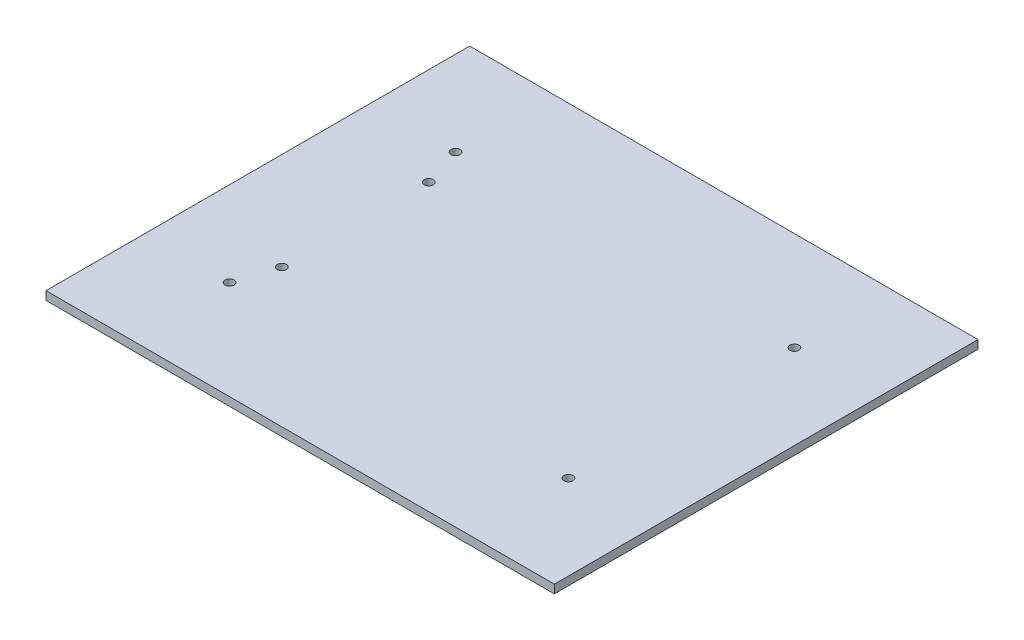
ISO-10303-21;
HEADER;
FILE_DESCRIPTION(('STEP AP214'),'2;1');
FILE_NAME('part.step','',(''),(''),'','','');
FILE_SCHEMA(('AUTOMOTIVE_DESIGN { 1 0 10303 214 1 1 1 1 }'));
ENDSEC;
DATA;
#1=APPLICATION_CONTEXT('core data for automotive mechanical design processes');
#2=APPLICATION_PROTOCOL_DEFINITION('international standard','automotive_design',2000,#1);
#3=PRODUCT_CONTEXT('',#1,'mechanical');
#4=PRODUCT('Part','Part','',(#3));
#5=PRODUCT_RELATED_PRODUCT_CATEGORY('part','',(#4));
#6=PRODUCT_DEFINITION_FORMATION('','',#4);
#7=PRODUCT_DEFINITION_CONTEXT('part definition',#1,'design');
#8=PRODUCT_DEFINITION('design','',#6,#7);
#9=PRODUCT_DEFINITION_SHAPE('','',#8);
#10=(LENGTH_UNIT() NAMED_UNIT(*) SI_UNIT(.MILLI.,.METRE.));
#11=(NAMED_UNIT(*) PLANE_ANGLE_UNIT() SI_UNIT($,.RADIAN.));
#12=(NAMED_UNIT(*) SI_UNIT($,.STERADIAN.) SOLID_ANGLE_UNIT());
#13=UNCERTAINTY_MEASURE_WITH_UNIT(LENGTH_MEASURE(1.E-05),#10,'distance_accuracy_value','');
#14=(GEOMETRIC_REPRESENTATION_CONTEXT(3) GLOBAL_UNCERTAINTY_ASSIGNED_CONTEXT((#13)) GLOBAL_UNIT_ASSIGNED_CONTEXT((#10,
#11,#12)) REPRESENTATION_CONTEXT('',''));
#15=CARTESIAN_POINT('',(0.,0.,0.));
#16=DIRECTION('',(0.,0.,1.));
#17=DIRECTION('',(1.,0.,0.));
#18=AXIS2_PLACEMENT_3D('',#15,#16,#17);
#19=CARTESIAN_POINT('',(0.,3.,0.));
#20=DIRECTION('',(0.,-1.,0.));
#21=DIRECTION('',(0.,0.,-1.));
#22=AXIS2_PLACEMENT_3D('',#19,#20,#21);
#23=PLANE('',#22);
#24=DIRECTION('',(0.,0.,-1.));
#25=VECTOR('',#24,1.);
#26=CARTESIAN_POINT('',(90.,3.,75.));
#27=LINE('',#26,#25);
#28=CARTESIAN_POINT('',(90.,3.,75.));
#29=VERTEX_POINT('',#28);
#30=CARTESIAN_POINT('',(90.,3.,-75.));
#31=VERTEX_POINT('',#30);
#32=EDGE_CURVE('E85',#29,#31,#27,.T.);
#33=ORIENTED_EDGE('',*,*,#32,.T.);
#34=DIRECTION('',(-1.,0.,0.));
#35=VECTOR('',#34,1.);
#36=CARTESIAN_POINT('',(-90.,3.,-75.));
#37=LINE('',#36,#35);
#38=CARTESIAN_POINT('',(-90.,3.,-75.));
#39=VERTEX_POINT('',#38);
#40=EDGE_CURVE('E80',#31,#39,#37,.T.);
#41=ORIENTED_EDGE('',*,*,#40,.T.);
#42=DIRECTION('',(0.,0.,1.));
#43=VECTOR('',#42,1.);
#44=CARTESIAN_POINT('',(-90.,3.,75.));
#45=LINE('',#44,#43);
#46=CARTESIAN_POINT('',(-90.,3.,75.));
#47=VERTEX_POINT('',#46);
#48=EDGE_CURVE('E83',#39,#47,#45,.T.);
#49=ORIENTED_EDGE('',*,*,#48,.T.);
#50=DIRECTION('',(1.,0.,0.));
#51=VECTOR('',#50,1.);
#52=CARTESIAN_POINT('',(-90.,3.,75.));
#53=LINE('',#52,#51);
#54=EDGE_CURVE('E50',#47,#29,#53,.T.);
#55=ORIENTED_EDGE('',*,*,#54,.T.);
#56=EDGE_LOOP('',(#33,#41,#49,#55));
#57=FACE_BOUND('',#56,.T.);
#58=CARTESIAN_POINT('',(-55.5,3.,26.));
#59=DIRECTION('',(0.,1.,0.));
#60=DIRECTION('',(0.,0.,1.));
#61=AXIS2_PLACEMENT_3D('',#58,#59,#60);
#62=CIRCLE('',#61,1.6);
#63=CARTESIAN_POINT('',(-55.5,3.,27.6));
#64=VERTEX_POINT('',#63);
#65=EDGE_CURVE('E100',#64,#64,#62,.T.);
#66=ORIENTED_EDGE('',*,*,#65,.F.);
#67=EDGE_LOOP('',(#66));
#68=FACE_BOUND('',#67,.T.);
#69=CARTESIAN_POINT('',(-60.,3.,40.));
#70=DIRECTION('',(0.,1.,0.));
#71=DIRECTION('',(0.,0.,1.));
#72=AXIS2_PLACEMENT_3D('',#69,#70,#71);
#73=CIRCLE('',#72,1.6);
#74=CARTESIAN_POINT('',(-60.,3.,41.6));
#75=VERTEX_POINT('',#74);
#76=EDGE_CURVE('E115',#75,#75,#73,.T.);
#77=ORIENTED_EDGE('',*,*,#76,.F.);
#78=EDGE_LOOP('',(#77));
#79=FACE_BOUND('',#78,.T.);
#80=CARTESIAN_POINT('',(-60.0000000000002,3.,-40.));
#81=DIRECTION('',(0.,1.,0.));
#82=DIRECTION('',(0.,0.,1.));
#83=AXIS2_PLACEMENT_3D('',#80,#81,#82);
#84=CIRCLE('',#83,1.6);
#85=CARTESIAN_POINT('',(-60.0000000000002,3.,-38.4));
#86=VERTEX_POINT('',#85);
#87=EDGE_CURVE('E121',#86,#86,#84,.T.);
#88=ORIENTED_EDGE('',*,*,#87,.F.);
#89=EDGE_LOOP('',(#88));
#90=FACE_BOUND('',#89,.T.);
#91=CARTESIAN_POINT('',(60.,3.,40.));
#92=DIRECTION('',(0.,1.,0.));
#93=DIRECTION('',(0.,0.,1.));
#94=AXIS2_PLACEMENT_3D('',#91,#92,#93);
#95=CIRCLE('',#94,1.6);
#96=CARTESIAN_POINT('',(60.,3.,41.6));
#97=VERTEX_POINT('',#96);
#98=EDGE_CURVE('E127',#97,#97,#95,.T.);
#99=ORIENTED_EDGE('',*,*,#98,.F.);
#100=EDGE_LOOP('',(#99));
#101=FACE_BOUND('',#100,.T.);
#102=CARTESIAN_POINT('',(59.9999999999998,3.,-40.));
#103=DIRECTION('',(0.,1.,0.));
#104=DIRECTION('',(0.,0.,1.));
#105=AXIS2_PLACEMENT_3D('',#102,#103,#104);
#106=CIRCLE('',#105,1.6);
#107=CARTESIAN_POINT('',(59.9999999999998,3.,-38.4));
#108=VERTEX_POINT('',#107);
#109=EDGE_CURVE('E133',#108,#108,#106,.T.);
#110=ORIENTED_EDGE('',*,*,#109,.F.);
#111=EDGE_LOOP('',(#110));
#112=FACE_BOUND('',#111,.T.);
#113=CARTESIAN_POINT('',(-55.5000000000002,3.,-26.));
#114=DIRECTION('',(0.,1.,0.));
#115=DIRECTION('',(0.,0.,1.));
#116=AXIS2_PLACEMENT_3D('',#113,#114,#115);
#117=CIRCLE('',#116,1.6);
#118=CARTESIAN_POINT('',(-55.5000000000002,3.,-24.4));
#119=VERTEX_POINT('',#118);
#120=EDGE_CURVE('E139',#119,#119,#117,.T.);
#121=ORIENTED_EDGE('',*,*,#120,.F.);
#122=EDGE_LOOP('',(#121));
#123=FACE_BOUND('',#122,.T.);
#124=ADVANCED_FACE('F33',(#57,#68,#79,#90,#101,#112,#123),#23,.F.);
#125=CARTESIAN_POINT('',(0.,0.,0.));
#126=DIRECTION('',(0.,-1.,0.));
#127=DIRECTION('',(0.,0.,-1.));
#128=AXIS2_PLACEMENT_3D('',#125,#126,#127);
#129=PLANE('',#128);
#130=CARTESIAN_POINT('',(59.9999999999998,0.,-40.));
#131=DIRECTION('',(0.,1.,0.));
#132=DIRECTION('',(0.,0.,1.));
#133=AXIS2_PLACEMENT_3D('',#130,#131,#132);
#134=CIRCLE('',#133,1.6);
#135=CARTESIAN_POINT('',(59.9999999999998,0.,-38.4));
#136=VERTEX_POINT('',#135);
#137=EDGE_CURVE('E136',#136,#136,#134,.T.);
#138=ORIENTED_EDGE('',*,*,#137,.T.);
#139=EDGE_LOOP('',(#138));
#140=FACE_BOUND('',#139,.T.);
#141=CARTESIAN_POINT('',(-60.0000000000002,0.,-40.));
#142=DIRECTION('',(0.,1.,0.));
#143=DIRECTION('',(0.,0.,1.));
#144=AXIS2_PLACEMENT_3D('',#141,#142,#143);
#145=CIRCLE('',#144,1.6);
#146=CARTESIAN_POINT('',(-60.0000000000002,0.,-38.4));
#147=VERTEX_POINT('',#146);
#148=EDGE_CURVE('E124',#147,#147,#145,.T.);
#149=ORIENTED_EDGE('',*,*,#148,.T.);
#150=EDGE_LOOP('',(#149));
#151=FACE_BOUND('',#150,.T.);
#152=CARTESIAN_POINT('',(-55.5,0.,26.));
#153=DIRECTION('',(0.,1.,0.));
#154=DIRECTION('',(0.,0.,1.));
#155=AXIS2_PLACEMENT_3D('',#152,#153,#154);
#156=CIRCLE('',#155,1.6);
#157=CARTESIAN_POINT('',(-55.5,0.,27.6));
#158=VERTEX_POINT('',#157);
#159=EDGE_CURVE('E112',#158,#158,#156,.T.);
#160=ORIENTED_EDGE('',*,*,#159,.T.);
#161=EDGE_LOOP('',(#160));
#162=FACE_BOUND('',#161,.T.);
#163=DIRECTION('',(0.,0.,-1.));
#164=VECTOR('',#163,1.);
#165=CARTESIAN_POINT('',(90.,0.,75.));
#166=LINE('',#165,#164);
#167=CARTESIAN_POINT('',(90.,0.,75.));
#168=VERTEX_POINT('',#167);
#169=CARTESIAN_POINT('',(90.,0.,-75.));
#170=VERTEX_POINT('',#169);
#171=EDGE_CURVE('E97',#168,#170,#166,.T.);
#172=ORIENTED_EDGE('',*,*,#171,.F.);
#173=DIRECTION('',(1.,0.,0.));
#174=VECTOR('',#173,1.);
#175=CARTESIAN_POINT('',(-90.,0.,75.));
#176=LINE('',#175,#174);
#177=CARTESIAN_POINT('',(-90.,0.,75.));
#178=VERTEX_POINT('',#177);
#179=EDGE_CURVE('E73',#178,#168,#176,.T.);
#180=ORIENTED_EDGE('',*,*,#179,.F.);
#181=DIRECTION('',(0.,0.,1.));
#182=VECTOR('',#181,1.);
#183=CARTESIAN_POINT('',(-90.,0.,75.));
#184=LINE('',#183,#182);
#185=CARTESIAN_POINT('',(-90.,0.,-75.));
#186=VERTEX_POINT('',#185);
#187=EDGE_CURVE('E67',#186,#178,#184,.T.);
#188=ORIENTED_EDGE('',*,*,#187,.F.);
#189=DIRECTION('',(-1.,0.,0.));
#190=VECTOR('',#189,1.);
#191=CARTESIAN_POINT('',(-90.,0.,-75.));
#192=LINE('',#191,#190);
#193=EDGE_CURVE('E89',#170,#186,#192,.T.);
#194=ORIENTED_EDGE('',*,*,#193,.F.);
#195=EDGE_LOOP('',(#172,#180,#188,#194));
#196=FACE_BOUND('',#195,.T.);
#197=CARTESIAN_POINT('',(-60.,0.,40.));
#198=DIRECTION('',(0.,1.,0.));
#199=DIRECTION('',(0.,0.,1.));
#200=AXIS2_PLACEMENT_3D('',#197,#198,#199);
#201=CIRCLE('',#200,1.6);
#202=CARTESIAN_POINT('',(-60.,0.,41.6));
#203=VERTEX_POINT('',#202);
#204=EDGE_CURVE('E118',#203,#203,#201,.T.);
#205=ORIENTED_EDGE('',*,*,#204,.T.);
#206=EDGE_LOOP('',(#205));
#207=FACE_BOUND('',#206,.T.);
#208=CARTESIAN_POINT('',(60.,0.,40.));
#209=DIRECTION('',(0.,1.,0.));
#210=DIRECTION('',(0.,0.,1.));
#211=AXIS2_PLACEMENT_3D('',#208,#209,#210);
#212=CIRCLE('',#211,1.6);
#213=CARTESIAN_POINT('',(60.,0.,41.6));
#214=VERTEX_POINT('',#213);
#215=EDGE_CURVE('E130',#214,#214,#212,.T.);
#216=ORIENTED_EDGE('',*,*,#215,.T.);
#217=EDGE_LOOP('',(#216));
#218=FACE_BOUND('',#217,.T.);
#219=CARTESIAN_POINT('',(-55.5000000000002,0.,-26.));
#220=DIRECTION('',(0.,1.,0.));
#221=DIRECTION('',(0.,0.,1.));
#222=AXIS2_PLACEMENT_3D('',#219,#220,#221);
#223=CIRCLE('',#222,1.6);
#224=CARTESIAN_POINT('',(-55.5000000000002,0.,-24.4));
#225=VERTEX_POINT('',#224);
#226=EDGE_CURVE('E142',#225,#225,#223,.T.);
#227=ORIENTED_EDGE('',*,*,#226,.T.);
#228=EDGE_LOOP('',(#227));
#229=FACE_BOUND('',#228,.T.);
#230=ADVANCED_FACE('F108',(#140,#151,#162,#196,#207,#218,#229),#129,.T.);
#231=CARTESIAN_POINT('',(90.,3.,75.));
#232=DIRECTION('',(-1.,0.,0.));
#233=DIRECTION('',(0.,0.,1.));
#234=AXIS2_PLACEMENT_3D('',#231,#232,#233);
#235=PLANE('',#234);
#236=ORIENTED_EDGE('',*,*,#171,.T.);
#237=DIRECTION('',(0.,-1.,0.));
#238=VECTOR('',#237,1.);
#239=CARTESIAN_POINT('',(90.,3.,-75.));
#240=LINE('',#239,#238);
#241=EDGE_CURVE('E11',#31,#170,#240,.T.);
#242=ORIENTED_EDGE('',*,*,#241,.F.);
#243=ORIENTED_EDGE('',*,*,#32,.F.);
#244=DIRECTION('',(0.,-1.,0.));
#245=VECTOR('',#244,1.);
#246=CARTESIAN_POINT('',(90.,3.,75.));
#247=LINE('',#246,#245);
#248=EDGE_CURVE('E93',#29,#168,#247,.T.);
#249=ORIENTED_EDGE('',*,*,#248,.T.);
#250=EDGE_LOOP('',(#236,#242,#243,#249));
#251=FACE_BOUND('',#250,.T.);
#252=ADVANCED_FACE('F35',(#251),#235,.F.);
#253=CARTESIAN_POINT('',(-90.,3.,-75.));
#254=DIRECTION('',(0.,0.,1.));
#255=DIRECTION('',(1.,0.,0.));
#256=AXIS2_PLACEMENT_3D('',#253,#254,#255);
#257=PLANE('',#256);
#258=ORIENTED_EDGE('',*,*,#193,.T.);
#259=DIRECTION('',(0.,-1.,0.));
#260=VECTOR('',#259,1.);
#261=CARTESIAN_POINT('',(-90.,3.,-75.));
#262=LINE('',#261,#260);
#263=EDGE_CURVE('E42',#39,#186,#262,.T.);
#264=ORIENTED_EDGE('',*,*,#263,.F.);
#265=ORIENTED_EDGE('',*,*,#40,.F.);
#266=ORIENTED_EDGE('',*,*,#241,.T.);
#267=EDGE_LOOP('',(#258,#264,#265,#266));
#268=FACE_BOUND('',#267,.T.);
#269=ADVANCED_FACE('F88',(#268),#257,.F.);
#270=CARTESIAN_POINT('',(-90.,3.,75.));
#271=DIRECTION('',(1.,0.,0.));
#272=DIRECTION('',(0.,0.,-1.));
#273=AXIS2_PLACEMENT_3D('',#270,#271,#272);
#274=PLANE('',#273);
#275=ORIENTED_EDGE('',*,*,#187,.T.);
#276=DIRECTION('',(0.,-1.,0.));
#277=VECTOR('',#276,1.);
#278=CARTESIAN_POINT('',(-90.,3.,75.));
#279=LINE('',#278,#277);
#280=EDGE_CURVE('E90',#47,#178,#279,.T.);
#281=ORIENTED_EDGE('',*,*,#280,.F.);
#282=ORIENTED_EDGE('',*,*,#48,.F.);
#283=ORIENTED_EDGE('',*,*,#263,.T.);
#284=EDGE_LOOP('',(#275,#281,#282,#283));
#285=FACE_BOUND('',#284,.T.);
#286=ADVANCED_FACE('F91',(#285),#274,.F.);
#287=CARTESIAN_POINT('',(-90.,3.,75.));
#288=DIRECTION('',(0.,0.,-1.));
#289=DIRECTION('',(-1.,0.,0.));
#290=AXIS2_PLACEMENT_3D('',#287,#288,#289);
#291=PLANE('',#290);
#292=ORIENTED_EDGE('',*,*,#179,.T.);
#293=ORIENTED_EDGE('',*,*,#248,.F.);
#294=ORIENTED_EDGE('',*,*,#54,.F.);
#295=ORIENTED_EDGE('',*,*,#280,.T.);
#296=EDGE_LOOP('',(#292,#293,#294,#295));
#297=FACE_BOUND('',#296,.T.);
#298=ADVANCED_FACE('F105',(#297),#291,.F.);
#299=CARTESIAN_POINT('',(-55.5,3.,26.));
#300=DIRECTION('',(0.,-1.,0.));
#301=DIRECTION('',(0.,0.,-1.));
#302=AXIS2_PLACEMENT_3D('',#299,#300,#301);
#303=CYLINDRICAL_SURFACE('',#302,1.6);
#304=ORIENTED_EDGE('',*,*,#65,.T.);
#305=EDGE_LOOP('',(#304));
#306=FACE_BOUND('',#305,.T.);
#307=ORIENTED_EDGE('',*,*,#159,.F.);
#308=EDGE_LOOP('',(#307));
#309=FACE_BOUND('',#308,.T.);
#310=ADVANCED_FACE('F159',(#306,#309),#303,.F.);
#311=CARTESIAN_POINT('',(-60.,3.,40.));
#312=DIRECTION('',(0.,-1.,0.));
#313=DIRECTION('',(0.,0.,-1.));
#314=AXIS2_PLACEMENT_3D('',#311,#312,#313);
#315=CYLINDRICAL_SURFACE('',#314,1.6);
#316=ORIENTED_EDGE('',*,*,#76,.T.);
#317=EDGE_LOOP('',(#316));
#318=FACE_BOUND('',#317,.T.);
#319=ORIENTED_EDGE('',*,*,#204,.F.);
#320=EDGE_LOOP('',(#319));
#321=FACE_BOUND('',#320,.T.);
#322=ADVANCED_FACE('F205',(#318,#321),#315,.F.);
#323=CARTESIAN_POINT('',(-60.0000000000002,3.,-40.));
#324=DIRECTION('',(0.,-1.,0.));
#325=DIRECTION('',(0.,0.,-1.));
#326=AXIS2_PLACEMENT_3D('',#323,#324,#325);
#327=CYLINDRICAL_SURFACE('',#326,1.6);
#328=ORIENTED_EDGE('',*,*,#87,.T.);
#329=EDGE_LOOP('',(#328));
#330=FACE_BOUND('',#329,.T.);
#331=ORIENTED_EDGE('',*,*,#148,.F.);
#332=EDGE_LOOP('',(#331));
#333=FACE_BOUND('',#332,.T.);
#334=ADVANCED_FACE('F213',(#330,#333),#327,.F.);
#335=CARTESIAN_POINT('',(60.,3.,40.));
#336=DIRECTION('',(0.,-1.,0.));
#337=DIRECTION('',(0.,0.,-1.));
#338=AXIS2_PLACEMENT_3D('',#335,#336,#337);
#339=CYLINDRICAL_SURFACE('',#338,1.6);
#340=ORIENTED_EDGE('',*,*,#98,.T.);
#341=EDGE_LOOP('',(#340));
#342=FACE_BOUND('',#341,.T.);
#343=ORIENTED_EDGE('',*,*,#215,.F.);
#344=EDGE_LOOP('',(#343));
#345=FACE_BOUND('',#344,.T.);
#346=ADVANCED_FACE('F221',(#342,#345),#339,.F.);
#347=CARTESIAN_POINT('',(59.9999999999998,3.,-40.));
#348=DIRECTION('',(0.,-1.,0.));
#349=DIRECTION('',(0.,0.,-1.));
#350=AXIS2_PLACEMENT_3D('',#347,#348,#349);
#351=CYLINDRICAL_SURFACE('',#350,1.6);
#352=ORIENTED_EDGE('',*,*,#109,.T.);
#353=EDGE_LOOP('',(#352));
#354=FACE_BOUND('',#353,.T.);
#355=ORIENTED_EDGE('',*,*,#137,.F.);
#356=EDGE_LOOP('',(#355));
#357=FACE_BOUND('',#356,.T.);
#358=ADVANCED_FACE('F230',(#354,#357),#351,.F.);
#359=CARTESIAN_POINT('',(-55.5000000000002,3.,-26.));
#360=DIRECTION('',(0.,-1.,0.));
#361=DIRECTION('',(0.,0.,-1.));
#362=AXIS2_PLACEMENT_3D('',#359,#360,#361);
#363=CYLINDRICAL_SURFACE('',#362,1.6);
#364=ORIENTED_EDGE('',*,*,#120,.T.);
#365=EDGE_LOOP('',(#364));
#366=FACE_BOUND('',#365,.T.);
#367=ORIENTED_EDGE('',*,*,#226,.F.);
#368=EDGE_LOOP('',(#367));
#369=FACE_BOUND('',#368,.T.);
#370=ADVANCED_FACE('F148',(#366,#369),#363,.F.);
#371=CLOSED_SHELL('',(#124,#230,#252,#269,#286,#298,#310,#322,#334,#346,#358,#370));
#372=MANIFOLD_SOLID_BREP('B2',#371);
#373=ADVANCED_BREP_SHAPE_REPRESENTATION('',(#18,#372),#14);
#374=SHAPE_DEFINITION_REPRESENTATION(#9,#373);
ENDSEC;
END-ISO-10303-21;
